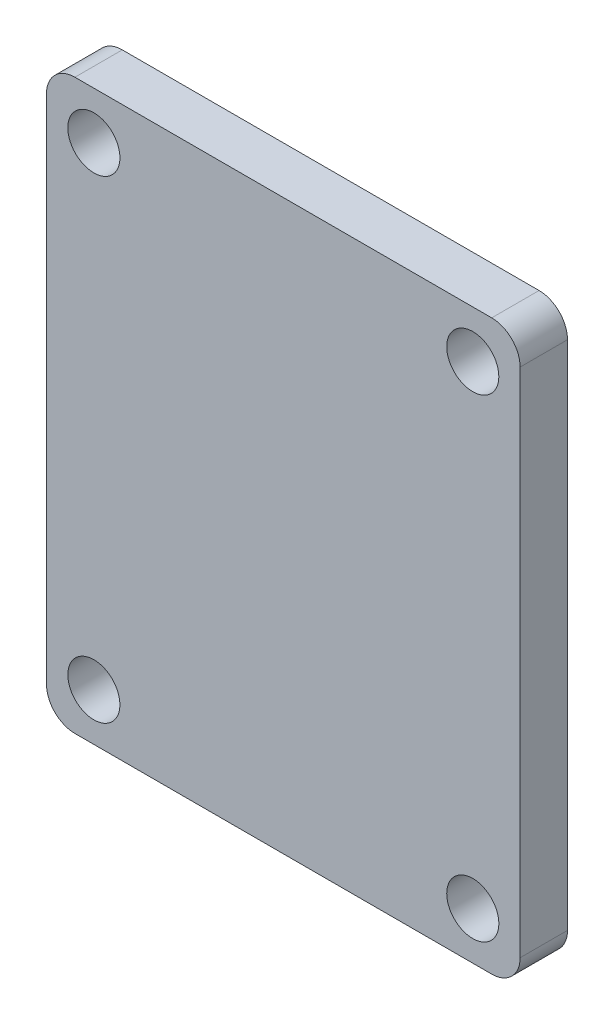
ISO-10303-21;
HEADER;
FILE_DESCRIPTION(('STEP AP214'),'2;1');
FILE_NAME('part.step','',(''),(''),'','','');
FILE_SCHEMA(('AUTOMOTIVE_DESIGN { 1 0 10303 214 1 1 1 1 }'));
ENDSEC;
DATA;
#1=APPLICATION_CONTEXT('core data for automotive mechanical design processes');
#2=APPLICATION_PROTOCOL_DEFINITION('international standard','automotive_design',2000,#1);
#3=PRODUCT_CONTEXT('',#1,'mechanical');
#4=PRODUCT('Part','Part','',(#3));
#5=PRODUCT_RELATED_PRODUCT_CATEGORY('part','',(#4));
#6=PRODUCT_DEFINITION_FORMATION('','',#4);
#7=PRODUCT_DEFINITION_CONTEXT('part definition',#1,'design');
#8=PRODUCT_DEFINITION('design','',#6,#7);
#9=PRODUCT_DEFINITION_SHAPE('','',#8);
#10=(LENGTH_UNIT() NAMED_UNIT(*) SI_UNIT(.MILLI.,.METRE.));
#11=(NAMED_UNIT(*) PLANE_ANGLE_UNIT() SI_UNIT($,.RADIAN.));
#12=(NAMED_UNIT(*) SI_UNIT($,.STERADIAN.) SOLID_ANGLE_UNIT());
#13=UNCERTAINTY_MEASURE_WITH_UNIT(LENGTH_MEASURE(1.E-05),#10,'distance_accuracy_value','');
#14=(GEOMETRIC_REPRESENTATION_CONTEXT(3) GLOBAL_UNCERTAINTY_ASSIGNED_CONTEXT((#13)) GLOBAL_UNIT_ASSIGNED_CONTEXT((#10,
#11,#12)) REPRESENTATION_CONTEXT('',''));
#15=CARTESIAN_POINT('',(0.,0.,0.));
#16=DIRECTION('',(0.,0.,1.));
#17=DIRECTION('',(1.,0.,0.));
#18=AXIS2_PLACEMENT_3D('',#15,#16,#17);
#19=CARTESIAN_POINT('',(3.,-57.,5.));
#20=DIRECTION('',(0.,0.,1.));
#21=DIRECTION('',(1.,0.,0.));
#22=AXIS2_PLACEMENT_3D('',#19,#20,#21);
#23=PLANE('',#22);
#24=CARTESIAN_POINT('',(45.,-55.,5.));
#25=DIRECTION('',(0.,0.,1.));
#26=DIRECTION('',(-1.,0.,0.));
#27=AXIS2_PLACEMENT_3D('',#24,#25,#26);
#28=CIRCLE('',#27,2.75);
#29=CARTESIAN_POINT('',(42.25,-55.,5.));
#30=VERTEX_POINT('',#29);
#31=EDGE_CURVE('E188',#30,#30,#28,.T.);
#32=ORIENTED_EDGE('',*,*,#31,.F.);
#33=EDGE_LOOP('',(#32));
#34=FACE_BOUND('',#33,.T.);
#35=CARTESIAN_POINT('',(5.,-5.00000000000001,5.));
#36=DIRECTION('',(0.,0.,1.));
#37=DIRECTION('',(1.,0.,0.));
#38=AXIS2_PLACEMENT_3D('',#35,#36,#37);
#39=CIRCLE('',#38,2.75);
#40=CARTESIAN_POINT('',(7.75,-5.00000000000001,5.));
#41=VERTEX_POINT('',#40);
#42=EDGE_CURVE('E134',#41,#41,#39,.T.);
#43=ORIENTED_EDGE('',*,*,#42,.F.);
#44=EDGE_LOOP('',(#43));
#45=FACE_BOUND('',#44,.T.);
#46=CARTESIAN_POINT('',(3.,-57.,5.));
#47=DIRECTION('',(0.,0.,1.));
#48=DIRECTION('',(1.,0.,0.));
#49=AXIS2_PLACEMENT_3D('',#46,#47,#48);
#50=CIRCLE('',#49,3.);
#51=CARTESIAN_POINT('',(0.,-57.,5.));
#52=VERTEX_POINT('',#51);
#53=CARTESIAN_POINT('',(3.00000000000002,-60.,5.));
#54=VERTEX_POINT('',#53);
#55=EDGE_CURVE('E145',#52,#54,#50,.T.);
#56=ORIENTED_EDGE('',*,*,#55,.T.);
#57=DIRECTION('',(1.,0.,0.));
#58=VECTOR('',#57,1.);
#59=CARTESIAN_POINT('',(3.00000000000002,-60.,5.));
#60=LINE('',#59,#58);
#61=CARTESIAN_POINT('',(47.,-60.,5.));
#62=VERTEX_POINT('',#61);
#63=EDGE_CURVE('E93',#54,#62,#60,.T.);
#64=ORIENTED_EDGE('',*,*,#63,.T.);
#65=CARTESIAN_POINT('',(47.,-57.,5.));
#66=DIRECTION('',(0.,0.,1.));
#67=DIRECTION('',(1.,0.,0.));
#68=AXIS2_PLACEMENT_3D('',#65,#66,#67);
#69=CIRCLE('',#68,3.);
#70=CARTESIAN_POINT('',(50.,-57.,5.));
#71=VERTEX_POINT('',#70);
#72=EDGE_CURVE('E160',#62,#71,#69,.T.);
#73=ORIENTED_EDGE('',*,*,#72,.T.);
#74=DIRECTION('',(0.,1.,0.));
#75=VECTOR('',#74,1.);
#76=CARTESIAN_POINT('',(50.,-57.,5.));
#77=LINE('',#76,#75);
#78=CARTESIAN_POINT('',(50.,-3.00000000000003,5.));
#79=VERTEX_POINT('',#78);
#80=EDGE_CURVE('E173',#71,#79,#77,.T.);
#81=ORIENTED_EDGE('',*,*,#80,.T.);
#82=CARTESIAN_POINT('',(47.,-3.00000000000001,5.));
#83=DIRECTION('',(0.,0.,1.));
#84=DIRECTION('',(1.,0.,0.));
#85=AXIS2_PLACEMENT_3D('',#82,#83,#84);
#86=CIRCLE('',#85,3.);
#87=CARTESIAN_POINT('',(47.,0.,5.));
#88=VERTEX_POINT('',#87);
#89=EDGE_CURVE('E112',#79,#88,#86,.T.);
#90=ORIENTED_EDGE('',*,*,#89,.T.);
#91=DIRECTION('',(-1.,0.,0.));
#92=VECTOR('',#91,1.);
#93=CARTESIAN_POINT('',(47.,0.,5.));
#94=LINE('',#93,#92);
#95=CARTESIAN_POINT('',(3.00000000000002,0.,5.));
#96=VERTEX_POINT('',#95);
#97=EDGE_CURVE('E106',#88,#96,#94,.T.);
#98=ORIENTED_EDGE('',*,*,#97,.T.);
#99=CARTESIAN_POINT('',(3.,-3.,5.));
#100=DIRECTION('',(0.,0.,1.));
#101=DIRECTION('',(-1.,0.,0.));
#102=AXIS2_PLACEMENT_3D('',#99,#100,#101);
#103=CIRCLE('',#102,3.);
#104=CARTESIAN_POINT('',(0.,-3.00000000000002,5.));
#105=VERTEX_POINT('',#104);
#106=EDGE_CURVE('E110',#96,#105,#103,.T.);
#107=ORIENTED_EDGE('',*,*,#106,.T.);
#108=DIRECTION('',(0.,-1.,0.));
#109=VECTOR('',#108,1.);
#110=CARTESIAN_POINT('',(0.,-3.00000000000002,5.));
#111=LINE('',#110,#109);
#112=EDGE_CURVE('E50',#105,#52,#111,.T.);
#113=ORIENTED_EDGE('',*,*,#112,.T.);
#114=EDGE_LOOP('',(#56,#64,#73,#81,#90,#98,#107,#113));
#115=FACE_BOUND('',#114,.T.);
#116=CARTESIAN_POINT('',(45.,-5.,5.));
#117=DIRECTION('',(0.,0.,1.));
#118=DIRECTION('',(1.,0.,0.));
#119=AXIS2_PLACEMENT_3D('',#116,#117,#118);
#120=CIRCLE('',#119,2.75);
#121=CARTESIAN_POINT('',(47.75,-5.,5.));
#122=VERTEX_POINT('',#121);
#123=EDGE_CURVE('E182',#122,#122,#120,.T.);
#124=ORIENTED_EDGE('',*,*,#123,.F.);
#125=EDGE_LOOP('',(#124));
#126=FACE_BOUND('',#125,.T.);
#127=CARTESIAN_POINT('',(4.99999999999999,-55.,5.));
#128=DIRECTION('',(0.,0.,1.));
#129=DIRECTION('',(-1.,0.,0.));
#130=AXIS2_PLACEMENT_3D('',#127,#128,#129);
#131=CIRCLE('',#130,2.75);
#132=CARTESIAN_POINT('',(2.24999999999999,-55.,5.));
#133=VERTEX_POINT('',#132);
#134=EDGE_CURVE('E194',#133,#133,#131,.T.);
#135=ORIENTED_EDGE('',*,*,#134,.F.);
#136=EDGE_LOOP('',(#135));
#137=FACE_BOUND('',#136,.T.);
#138=ADVANCED_FACE('F33',(#34,#45,#115,#126,#137),#23,.T.);
#139=CARTESIAN_POINT('',(3.,-57.,0.));
#140=DIRECTION('',(0.,0.,1.));
#141=DIRECTION('',(1.,0.,0.));
#142=AXIS2_PLACEMENT_3D('',#139,#140,#141);
#143=PLANE('',#142);
#144=CARTESIAN_POINT('',(3.,-57.,0.));
#145=DIRECTION('',(0.,0.,1.));
#146=DIRECTION('',(1.,0.,0.));
#147=AXIS2_PLACEMENT_3D('',#144,#145,#146);
#148=CIRCLE('',#147,3.);
#149=CARTESIAN_POINT('',(0.,-57.,0.));
#150=VERTEX_POINT('',#149);
#151=CARTESIAN_POINT('',(3.00000000000002,-60.,0.));
#152=VERTEX_POINT('',#151);
#153=EDGE_CURVE('E130',#150,#152,#148,.T.);
#154=ORIENTED_EDGE('',*,*,#153,.F.);
#155=DIRECTION('',(0.,-1.,0.));
#156=VECTOR('',#155,1.);
#157=CARTESIAN_POINT('',(0.,-3.00000000000002,0.));
#158=LINE('',#157,#156);
#159=CARTESIAN_POINT('',(0.,-3.00000000000002,0.));
#160=VERTEX_POINT('',#159);
#161=EDGE_CURVE('E85',#160,#150,#158,.T.);
#162=ORIENTED_EDGE('',*,*,#161,.F.);
#163=CARTESIAN_POINT('',(3.,-3.,0.));
#164=DIRECTION('',(0.,0.,1.));
#165=DIRECTION('',(-1.,0.,0.));
#166=AXIS2_PLACEMENT_3D('',#163,#164,#165);
#167=CIRCLE('',#166,3.);
#168=CARTESIAN_POINT('',(3.00000000000002,0.,0.));
#169=VERTEX_POINT('',#168);
#170=EDGE_CURVE('E79',#169,#160,#167,.T.);
#171=ORIENTED_EDGE('',*,*,#170,.F.);
#172=DIRECTION('',(-1.,0.,0.));
#173=VECTOR('',#172,1.);
#174=CARTESIAN_POINT('',(47.,0.,0.));
#175=LINE('',#174,#173);
#176=CARTESIAN_POINT('',(47.,0.,0.));
#177=VERTEX_POINT('',#176);
#178=EDGE_CURVE('E120',#177,#169,#175,.T.);
#179=ORIENTED_EDGE('',*,*,#178,.F.);
#180=CARTESIAN_POINT('',(47.,-3.00000000000001,0.));
#181=DIRECTION('',(0.,0.,1.));
#182=DIRECTION('',(1.,0.,0.));
#183=AXIS2_PLACEMENT_3D('',#180,#181,#182);
#184=CIRCLE('',#183,3.);
#185=CARTESIAN_POINT('',(50.,-3.00000000000003,0.));
#186=VERTEX_POINT('',#185);
#187=EDGE_CURVE('E140',#186,#177,#184,.T.);
#188=ORIENTED_EDGE('',*,*,#187,.F.);
#189=DIRECTION('',(0.,1.,0.));
#190=VECTOR('',#189,1.);
#191=CARTESIAN_POINT('',(50.,-57.,0.));
#192=LINE('',#191,#190);
#193=CARTESIAN_POINT('',(50.,-57.,0.));
#194=VERTEX_POINT('',#193);
#195=EDGE_CURVE('E138',#194,#186,#192,.T.);
#196=ORIENTED_EDGE('',*,*,#195,.F.);
#197=CARTESIAN_POINT('',(47.,-57.,0.));
#198=DIRECTION('',(0.,0.,1.));
#199=DIRECTION('',(1.,0.,0.));
#200=AXIS2_PLACEMENT_3D('',#197,#198,#199);
#201=CIRCLE('',#200,3.);
#202=CARTESIAN_POINT('',(47.,-60.,0.));
#203=VERTEX_POINT('',#202);
#204=EDGE_CURVE('E136',#203,#194,#201,.T.);
#205=ORIENTED_EDGE('',*,*,#204,.F.);
#206=DIRECTION('',(1.,0.,0.));
#207=VECTOR('',#206,1.);
#208=CARTESIAN_POINT('',(3.00000000000002,-60.,0.));
#209=LINE('',#208,#207);
#210=EDGE_CURVE('E133',#152,#203,#209,.T.);
#211=ORIENTED_EDGE('',*,*,#210,.F.);
#212=EDGE_LOOP('',(#154,#162,#171,#179,#188,#196,#205,#211));
#213=FACE_BOUND('',#212,.T.);
#214=CARTESIAN_POINT('',(5.,-5.00000000000001,0.));
#215=DIRECTION('',(0.,0.,1.));
#216=DIRECTION('',(1.,0.,0.));
#217=AXIS2_PLACEMENT_3D('',#214,#215,#216);
#218=CIRCLE('',#217,2.75);
#219=CARTESIAN_POINT('',(7.75,-5.00000000000001,0.));
#220=VERTEX_POINT('',#219);
#221=EDGE_CURVE('E179',#220,#220,#218,.T.);
#222=ORIENTED_EDGE('',*,*,#221,.T.);
#223=EDGE_LOOP('',(#222));
#224=FACE_BOUND('',#223,.T.);
#225=CARTESIAN_POINT('',(45.,-5.,0.));
#226=DIRECTION('',(0.,0.,1.));
#227=DIRECTION('',(1.,0.,0.));
#228=AXIS2_PLACEMENT_3D('',#225,#226,#227);
#229=CIRCLE('',#228,2.75);
#230=CARTESIAN_POINT('',(47.75,-5.,0.));
#231=VERTEX_POINT('',#230);
#232=EDGE_CURVE('E185',#231,#231,#229,.T.);
#233=ORIENTED_EDGE('',*,*,#232,.T.);
#234=EDGE_LOOP('',(#233));
#235=FACE_BOUND('',#234,.T.);
#236=CARTESIAN_POINT('',(45.,-55.,0.));
#237=DIRECTION('',(0.,0.,1.));
#238=DIRECTION('',(-1.,0.,0.));
#239=AXIS2_PLACEMENT_3D('',#236,#237,#238);
#240=CIRCLE('',#239,2.75);
#241=CARTESIAN_POINT('',(42.25,-55.,0.));
#242=VERTEX_POINT('',#241);
#243=EDGE_CURVE('E191',#242,#242,#240,.T.);
#244=ORIENTED_EDGE('',*,*,#243,.T.);
#245=EDGE_LOOP('',(#244));
#246=FACE_BOUND('',#245,.T.);
#247=CARTESIAN_POINT('',(4.99999999999999,-55.,0.));
#248=DIRECTION('',(0.,0.,1.));
#249=DIRECTION('',(-1.,0.,0.));
#250=AXIS2_PLACEMENT_3D('',#247,#248,#249);
#251=CIRCLE('',#250,2.75);
#252=CARTESIAN_POINT('',(2.24999999999999,-55.,0.));
#253=VERTEX_POINT('',#252);
#254=EDGE_CURVE('E197',#253,#253,#251,.T.);
#255=ORIENTED_EDGE('',*,*,#254,.T.);
#256=EDGE_LOOP('',(#255));
#257=FACE_BOUND('',#256,.T.);
#258=ADVANCED_FACE('F164',(#213,#224,#235,#246,#257),#143,.F.);
#259=CARTESIAN_POINT('',(3.,-57.,5.));
#260=DIRECTION('',(0.,0.,-1.));
#261=DIRECTION('',(-1.,0.,0.));
#262=AXIS2_PLACEMENT_3D('',#259,#260,#261);
#263=CYLINDRICAL_SURFACE('',#262,3.);
#264=ORIENTED_EDGE('',*,*,#153,.T.);
#265=DIRECTION('',(0.,0.,-1.));
#266=VECTOR('',#265,1.);
#267=CARTESIAN_POINT('',(3.00000000000002,-60.,5.));
#268=LINE('',#267,#266);
#269=EDGE_CURVE('E11',#54,#152,#268,.T.);
#270=ORIENTED_EDGE('',*,*,#269,.F.);
#271=ORIENTED_EDGE('',*,*,#55,.F.);
#272=DIRECTION('',(0.,0.,-1.));
#273=VECTOR('',#272,1.);
#274=CARTESIAN_POINT('',(0.,-57.,5.));
#275=LINE('',#274,#273);
#276=EDGE_CURVE('E126',#52,#150,#275,.T.);
#277=ORIENTED_EDGE('',*,*,#276,.T.);
#278=EDGE_LOOP('',(#264,#270,#271,#277));
#279=FACE_BOUND('',#278,.T.);
#280=ADVANCED_FACE('F35',(#279),#263,.T.);
#281=CARTESIAN_POINT('',(3.00000000000002,-60.,5.));
#282=DIRECTION('',(0.,1.,0.));
#283=DIRECTION('',(0.,0.,1.));
#284=AXIS2_PLACEMENT_3D('',#281,#282,#283);
#285=PLANE('',#284);
#286=ORIENTED_EDGE('',*,*,#210,.T.);
#287=DIRECTION('',(0.,0.,-1.));
#288=VECTOR('',#287,1.);
#289=CARTESIAN_POINT('',(47.,-60.,5.));
#290=LINE('',#289,#288);
#291=EDGE_CURVE('E42',#62,#203,#290,.T.);
#292=ORIENTED_EDGE('',*,*,#291,.F.);
#293=ORIENTED_EDGE('',*,*,#63,.F.);
#294=ORIENTED_EDGE('',*,*,#269,.T.);
#295=EDGE_LOOP('',(#286,#292,#293,#294));
#296=FACE_BOUND('',#295,.T.);
#297=ADVANCED_FACE('F231',(#296),#285,.F.);
#298=CARTESIAN_POINT('',(47.,-57.,5.));
#299=DIRECTION('',(0.,0.,-1.));
#300=DIRECTION('',(-1.,0.,0.));
#301=AXIS2_PLACEMENT_3D('',#298,#299,#300);
#302=CYLINDRICAL_SURFACE('',#301,3.);
#303=ORIENTED_EDGE('',*,*,#204,.T.);
#304=DIRECTION('',(0.,0.,-1.));
#305=VECTOR('',#304,1.);
#306=CARTESIAN_POINT('',(50.,-57.,5.));
#307=LINE('',#306,#305);
#308=EDGE_CURVE('E152',#71,#194,#307,.T.);
#309=ORIENTED_EDGE('',*,*,#308,.F.);
#310=ORIENTED_EDGE('',*,*,#72,.F.);
#311=ORIENTED_EDGE('',*,*,#291,.T.);
#312=EDGE_LOOP('',(#303,#309,#310,#311));
#313=FACE_BOUND('',#312,.T.);
#314=ADVANCED_FACE('F158',(#313),#302,.T.);
#315=CARTESIAN_POINT('',(50.,-57.,5.));
#316=DIRECTION('',(-1.,0.,0.));
#317=DIRECTION('',(0.,0.,1.));
#318=AXIS2_PLACEMENT_3D('',#315,#316,#317);
#319=PLANE('',#318);
#320=ORIENTED_EDGE('',*,*,#195,.T.);
#321=DIRECTION('',(0.,0.,-1.));
#322=VECTOR('',#321,1.);
#323=CARTESIAN_POINT('',(50.,-3.00000000000003,5.));
#324=LINE('',#323,#322);
#325=EDGE_CURVE('E149',#79,#186,#324,.T.);
#326=ORIENTED_EDGE('',*,*,#325,.F.);
#327=ORIENTED_EDGE('',*,*,#80,.F.);
#328=ORIENTED_EDGE('',*,*,#308,.T.);
#329=EDGE_LOOP('',(#320,#326,#327,#328));
#330=FACE_BOUND('',#329,.T.);
#331=ADVANCED_FACE('F169',(#330),#319,.F.);
#332=CARTESIAN_POINT('',(47.,-3.00000000000001,5.));
#333=DIRECTION('',(0.,0.,-1.));
#334=DIRECTION('',(-1.,0.,0.));
#335=AXIS2_PLACEMENT_3D('',#332,#333,#334);
#336=CYLINDRICAL_SURFACE('',#335,3.);
#337=ORIENTED_EDGE('',*,*,#187,.T.);
#338=DIRECTION('',(0.,0.,-1.));
#339=VECTOR('',#338,1.);
#340=CARTESIAN_POINT('',(47.,0.,5.));
#341=LINE('',#340,#339);
#342=EDGE_CURVE('E121',#88,#177,#341,.T.);
#343=ORIENTED_EDGE('',*,*,#342,.F.);
#344=ORIENTED_EDGE('',*,*,#89,.F.);
#345=ORIENTED_EDGE('',*,*,#325,.T.);
#346=EDGE_LOOP('',(#337,#343,#344,#345));
#347=FACE_BOUND('',#346,.T.);
#348=ADVANCED_FACE('F172',(#347),#336,.T.);
#349=CARTESIAN_POINT('',(47.,0.,5.));
#350=DIRECTION('',(0.,-1.,0.));
#351=DIRECTION('',(1.,0.,0.));
#352=AXIS2_PLACEMENT_3D('',#349,#350,#351);
#353=PLANE('',#352);
#354=ORIENTED_EDGE('',*,*,#178,.T.);
#355=DIRECTION('',(0.,0.,-1.));
#356=VECTOR('',#355,1.);
#357=CARTESIAN_POINT('',(3.00000000000002,0.,5.));
#358=LINE('',#357,#356);
#359=EDGE_CURVE('E117',#96,#169,#358,.T.);
#360=ORIENTED_EDGE('',*,*,#359,.F.);
#361=ORIENTED_EDGE('',*,*,#97,.F.);
#362=ORIENTED_EDGE('',*,*,#342,.T.);
#363=EDGE_LOOP('',(#354,#360,#361,#362));
#364=FACE_BOUND('',#363,.T.);
#365=ADVANCED_FACE('F118',(#364),#353,.F.);
#366=CARTESIAN_POINT('',(3.,-3.,5.));
#367=DIRECTION('',(0.,0.,-1.));
#368=DIRECTION('',(-1.,0.,0.));
#369=AXIS2_PLACEMENT_3D('',#366,#367,#368);
#370=CYLINDRICAL_SURFACE('',#369,3.);
#371=ORIENTED_EDGE('',*,*,#170,.T.);
#372=DIRECTION('',(0.,0.,-1.));
#373=VECTOR('',#372,1.);
#374=CARTESIAN_POINT('',(0.,-3.00000000000002,5.));
#375=LINE('',#374,#373);
#376=EDGE_CURVE('E122',#105,#160,#375,.T.);
#377=ORIENTED_EDGE('',*,*,#376,.F.);
#378=ORIENTED_EDGE('',*,*,#106,.F.);
#379=ORIENTED_EDGE('',*,*,#359,.T.);
#380=EDGE_LOOP('',(#371,#377,#378,#379));
#381=FACE_BOUND('',#380,.T.);
#382=ADVANCED_FACE('F124',(#381),#370,.T.);
#383=CARTESIAN_POINT('',(0.,-3.00000000000002,5.));
#384=DIRECTION('',(1.,0.,0.));
#385=DIRECTION('',(0.,0.,-1.));
#386=AXIS2_PLACEMENT_3D('',#383,#384,#385);
#387=PLANE('',#386);
#388=ORIENTED_EDGE('',*,*,#161,.T.);
#389=ORIENTED_EDGE('',*,*,#276,.F.);
#390=ORIENTED_EDGE('',*,*,#112,.F.);
#391=ORIENTED_EDGE('',*,*,#376,.T.);
#392=EDGE_LOOP('',(#388,#389,#390,#391));
#393=FACE_BOUND('',#392,.T.);
#394=ADVANCED_FACE('F219',(#393),#387,.F.);
#395=CARTESIAN_POINT('',(5.,-5.00000000000001,5.));
#396=DIRECTION('',(0.,0.,-1.));
#397=DIRECTION('',(-1.,0.,0.));
#398=AXIS2_PLACEMENT_3D('',#395,#396,#397);
#399=CYLINDRICAL_SURFACE('',#398,2.75);
#400=ORIENTED_EDGE('',*,*,#42,.T.);
#401=EDGE_LOOP('',(#400));
#402=FACE_BOUND('',#401,.T.);
#403=ORIENTED_EDGE('',*,*,#221,.F.);
#404=EDGE_LOOP('',(#403));
#405=FACE_BOUND('',#404,.T.);
#406=ADVANCED_FACE('F216',(#402,#405),#399,.F.);
#407=CARTESIAN_POINT('',(45.,-5.,5.));
#408=DIRECTION('',(0.,0.,-1.));
#409=DIRECTION('',(-1.,0.,0.));
#410=AXIS2_PLACEMENT_3D('',#407,#408,#409);
#411=CYLINDRICAL_SURFACE('',#410,2.75);
#412=ORIENTED_EDGE('',*,*,#123,.T.);
#413=EDGE_LOOP('',(#412));
#414=FACE_BOUND('',#413,.T.);
#415=ORIENTED_EDGE('',*,*,#232,.F.);
#416=EDGE_LOOP('',(#415));
#417=FACE_BOUND('',#416,.T.);
#418=ADVANCED_FACE('F295',(#414,#417),#411,.F.);
#419=CARTESIAN_POINT('',(45.,-55.,5.));
#420=DIRECTION('',(0.,0.,-1.));
#421=DIRECTION('',(-1.,0.,0.));
#422=AXIS2_PLACEMENT_3D('',#419,#420,#421);
#423=CYLINDRICAL_SURFACE('',#422,2.75);
#424=ORIENTED_EDGE('',*,*,#31,.T.);
#425=EDGE_LOOP('',(#424));
#426=FACE_BOUND('',#425,.T.);
#427=ORIENTED_EDGE('',*,*,#243,.F.);
#428=EDGE_LOOP('',(#427));
#429=FACE_BOUND('',#428,.T.);
#430=ADVANCED_FACE('F303',(#426,#429),#423,.F.);
#431=CARTESIAN_POINT('',(4.99999999999999,-55.,5.));
#432=DIRECTION('',(0.,0.,-1.));
#433=DIRECTION('',(-1.,0.,0.));
#434=AXIS2_PLACEMENT_3D('',#431,#432,#433);
#435=CYLINDRICAL_SURFACE('',#434,2.75);
#436=ORIENTED_EDGE('',*,*,#134,.T.);
#437=EDGE_LOOP('',(#436));
#438=FACE_BOUND('',#437,.T.);
#439=ORIENTED_EDGE('',*,*,#254,.F.);
#440=EDGE_LOOP('',(#439));
#441=FACE_BOUND('',#440,.T.);
#442=ADVANCED_FACE('F203',(#438,#441),#435,.F.);
#443=CLOSED_SHELL('',(#138,#258,#280,#297,#314,#331,#348,#365,#382,#394,#406,#418,#430,#442));
#444=MANIFOLD_SOLID_BREP('B2',#443);
#445=ADVANCED_BREP_SHAPE_REPRESENTATION('',(#18,#444),#14);
#446=SHAPE_DEFINITION_REPRESENTATION(#9,#445);
ENDSEC;
END-ISO-10303-21;
